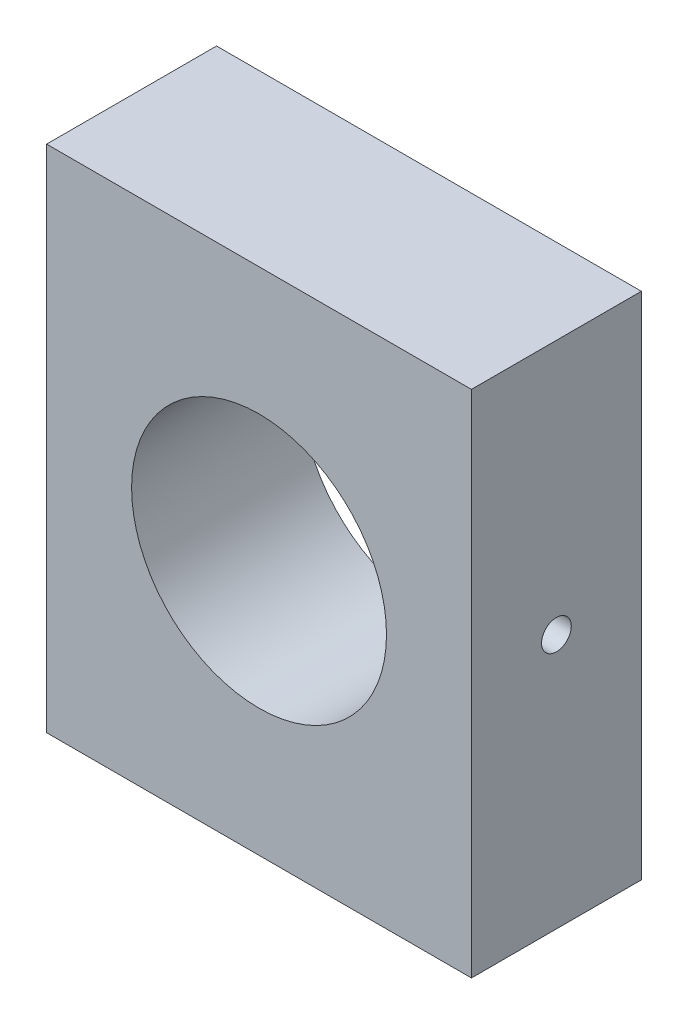
ISO-10303-21;
HEADER;
FILE_DESCRIPTION(('STEP AP214'),'2;1');
FILE_NAME('part.step','',(''),(''),'','','');
FILE_SCHEMA(('AUTOMOTIVE_DESIGN { 1 0 10303 214 1 1 1 1 }'));
ENDSEC;
DATA;
#1=APPLICATION_CONTEXT('core data for automotive mechanical design processes');
#2=APPLICATION_PROTOCOL_DEFINITION('international standard','automotive_design',2000,#1);
#3=PRODUCT_CONTEXT('',#1,'mechanical');
#4=PRODUCT('Part','Part','',(#3));
#5=PRODUCT_RELATED_PRODUCT_CATEGORY('part','',(#4));
#6=PRODUCT_DEFINITION_FORMATION('','',#4);
#7=PRODUCT_DEFINITION_CONTEXT('part definition',#1,'design');
#8=PRODUCT_DEFINITION('design','',#6,#7);
#9=PRODUCT_DEFINITION_SHAPE('','',#8);
#10=(LENGTH_UNIT() NAMED_UNIT(*) SI_UNIT(.MILLI.,.METRE.));
#11=(NAMED_UNIT(*) PLANE_ANGLE_UNIT() SI_UNIT($,.RADIAN.));
#12=(NAMED_UNIT(*) SI_UNIT($,.STERADIAN.) SOLID_ANGLE_UNIT());
#13=UNCERTAINTY_MEASURE_WITH_UNIT(LENGTH_MEASURE(1.E-05),#10,'distance_accuracy_value','');
#14=(GEOMETRIC_REPRESENTATION_CONTEXT(3) GLOBAL_UNCERTAINTY_ASSIGNED_CONTEXT((#13)) GLOBAL_UNIT_ASSIGNED_CONTEXT((#10,
#11,#12)) REPRESENTATION_CONTEXT('',''));
#15=CARTESIAN_POINT('',(0.,0.,0.));
#16=DIRECTION('',(0.,0.,1.));
#17=DIRECTION('',(1.,0.,0.));
#18=AXIS2_PLACEMENT_3D('',#15,#16,#17);
#19=CARTESIAN_POINT('',(0.,0.,40.));
#20=DIRECTION('',(0.,0.,1.));
#21=DIRECTION('',(1.,0.,0.));
#22=AXIS2_PLACEMENT_3D('',#19,#20,#21);
#23=PLANE('',#22);
#24=DIRECTION('',(0.,-1.,0.));
#25=VECTOR('',#24,1.);
#26=CARTESIAN_POINT('',(-34.5135037504516,45.0602409638554,40.));
#27=LINE('',#26,#25);
#28=CARTESIAN_POINT('',(-34.5135037504516,45.0602409638554,40.));
#29=VERTEX_POINT('',#28);
#30=CARTESIAN_POINT('',(-34.5135037504515,-74.9397590361446,40.));
#31=VERTEX_POINT('',#30);
#32=EDGE_CURVE('E90',#29,#31,#27,.T.);
#33=ORIENTED_EDGE('',*,*,#32,.T.);
#34=DIRECTION('',(1.,0.,0.));
#35=VECTOR('',#34,1.);
#36=CARTESIAN_POINT('',(-34.5135037504515,-74.9397590361446,40.));
#37=LINE('',#36,#35);
#38=CARTESIAN_POINT('',(65.4864962495484,-74.9397590361446,40.));
#39=VERTEX_POINT('',#38);
#40=EDGE_CURVE('E85',#31,#39,#37,.T.);
#41=ORIENTED_EDGE('',*,*,#40,.T.);
#42=DIRECTION('',(0.,1.,0.));
#43=VECTOR('',#42,1.);
#44=CARTESIAN_POINT('',(65.4864962495484,45.0602409638554,40.));
#45=LINE('',#44,#43);
#46=CARTESIAN_POINT('',(65.4864962495484,45.0602409638554,40.));
#47=VERTEX_POINT('',#46);
#48=EDGE_CURVE('E88',#39,#47,#45,.T.);
#49=ORIENTED_EDGE('',*,*,#48,.T.);
#50=DIRECTION('',(-1.,0.,0.));
#51=VECTOR('',#50,1.);
#52=CARTESIAN_POINT('',(-34.5135037504516,45.0602409638554,40.));
#53=LINE('',#52,#51);
#54=EDGE_CURVE('E55',#47,#29,#53,.T.);
#55=ORIENTED_EDGE('',*,*,#54,.T.);
#56=EDGE_LOOP('',(#33,#41,#49,#55));
#57=FACE_BOUND('',#56,.T.);
#58=CARTESIAN_POINT('',(15.4864962495484,-14.9397590361446,40.));
#59=DIRECTION('',(0.,0.,1.));
#60=DIRECTION('',(1.,0.,0.));
#61=AXIS2_PLACEMENT_3D('',#58,#59,#60);
#62=CIRCLE('',#61,30.);
#63=CARTESIAN_POINT('',(45.4864962495485,-14.9397590361446,40.));
#64=VERTEX_POINT('',#63);
#65=EDGE_CURVE('E105',#64,#64,#62,.T.);
#66=ORIENTED_EDGE('',*,*,#65,.F.);
#67=EDGE_LOOP('',(#66));
#68=FACE_BOUND('',#67,.T.);
#69=ADVANCED_FACE('F38',(#57,#68),#23,.T.);
#70=CARTESIAN_POINT('',(0.,0.,0.));
#71=DIRECTION('',(0.,0.,1.));
#72=DIRECTION('',(1.,0.,0.));
#73=AXIS2_PLACEMENT_3D('',#70,#71,#72);
#74=PLANE('',#73);
#75=DIRECTION('',(0.,-1.,0.));
#76=VECTOR('',#75,1.);
#77=CARTESIAN_POINT('',(-34.5135037504516,45.0602409638554,0.));
#78=LINE('',#77,#76);
#79=CARTESIAN_POINT('',(-34.5135037504516,45.0602409638554,0.));
#80=VERTEX_POINT('',#79);
#81=CARTESIAN_POINT('',(-34.5135037504515,-74.9397590361446,0.));
#82=VERTEX_POINT('',#81);
#83=EDGE_CURVE('E102',#80,#82,#78,.T.);
#84=ORIENTED_EDGE('',*,*,#83,.F.);
#85=DIRECTION('',(-1.,0.,0.));
#86=VECTOR('',#85,1.);
#87=CARTESIAN_POINT('',(-34.5135037504516,45.0602409638554,0.));
#88=LINE('',#87,#86);
#89=CARTESIAN_POINT('',(65.4864962495484,45.0602409638554,0.));
#90=VERTEX_POINT('',#89);
#91=EDGE_CURVE('E78',#90,#80,#88,.T.);
#92=ORIENTED_EDGE('',*,*,#91,.F.);
#93=DIRECTION('',(0.,1.,0.));
#94=VECTOR('',#93,1.);
#95=CARTESIAN_POINT('',(65.4864962495484,45.0602409638554,0.));
#96=LINE('',#95,#94);
#97=CARTESIAN_POINT('',(65.4864962495484,-74.9397590361446,0.));
#98=VERTEX_POINT('',#97);
#99=EDGE_CURVE('E72',#98,#90,#96,.T.);
#100=ORIENTED_EDGE('',*,*,#99,.F.);
#101=DIRECTION('',(1.,0.,0.));
#102=VECTOR('',#101,1.);
#103=CARTESIAN_POINT('',(-34.5135037504515,-74.9397590361446,0.));
#104=LINE('',#103,#102);
#105=EDGE_CURVE('E94',#82,#98,#104,.T.);
#106=ORIENTED_EDGE('',*,*,#105,.F.);
#107=EDGE_LOOP('',(#84,#92,#100,#106));
#108=FACE_BOUND('',#107,.T.);
#109=CARTESIAN_POINT('',(15.4864962495484,-14.9397590361446,0.));
#110=DIRECTION('',(0.,0.,1.));
#111=DIRECTION('',(1.,0.,0.));
#112=AXIS2_PLACEMENT_3D('',#109,#110,#111);
#113=CIRCLE('',#112,30.);
#114=CARTESIAN_POINT('',(45.4864962495485,-14.9397590361446,0.));
#115=VERTEX_POINT('',#114);
#116=EDGE_CURVE('E117',#115,#115,#113,.T.);
#117=ORIENTED_EDGE('',*,*,#116,.T.);
#118=EDGE_LOOP('',(#117));
#119=FACE_BOUND('',#118,.T.);
#120=ADVANCED_FACE('F113',(#108,#119),#74,.F.);
#121=CARTESIAN_POINT('',(-34.5135037504516,45.0602409638554,40.));
#122=DIRECTION('',(1.,0.,0.));
#123=DIRECTION('',(0.,1.,0.));
#124=AXIS2_PLACEMENT_3D('',#121,#122,#123);
#125=PLANE('',#124);
#126=CARTESIAN_POINT('',(-34.5135037504516,-14.9397590361446,20.));
#127=DIRECTION('',(-1.,0.,0.));
#128=DIRECTION('',(0.,-1.,0.));
#129=AXIS2_PLACEMENT_3D('',#126,#127,#128);
#130=CIRCLE('',#129,3.5);
#131=CARTESIAN_POINT('',(-34.5135037504516,-18.4397590361446,20.));
#132=VERTEX_POINT('',#131);
#133=EDGE_CURVE('E123',#132,#132,#130,.T.);
#134=ORIENTED_EDGE('',*,*,#133,.F.);
#135=EDGE_LOOP('',(#134));
#136=FACE_BOUND('',#135,.T.);
#137=ORIENTED_EDGE('',*,*,#83,.T.);
#138=DIRECTION('',(0.,0.,-1.));
#139=VECTOR('',#138,1.);
#140=CARTESIAN_POINT('',(-34.5135037504515,-74.9397590361446,40.));
#141=LINE('',#140,#139);
#142=EDGE_CURVE('E11',#31,#82,#141,.T.);
#143=ORIENTED_EDGE('',*,*,#142,.F.);
#144=ORIENTED_EDGE('',*,*,#32,.F.);
#145=DIRECTION('',(0.,0.,-1.));
#146=VECTOR('',#145,1.);
#147=CARTESIAN_POINT('',(-34.5135037504516,45.0602409638554,40.));
#148=LINE('',#147,#146);
#149=EDGE_CURVE('E98',#29,#80,#148,.T.);
#150=ORIENTED_EDGE('',*,*,#149,.T.);
#151=EDGE_LOOP('',(#137,#143,#144,#150));
#152=FACE_BOUND('',#151,.T.);
#153=ADVANCED_FACE('F40',(#136,#152),#125,.F.);
#154=CARTESIAN_POINT('',(-34.5135037504515,-74.9397590361446,40.));
#155=DIRECTION('',(0.,1.,0.));
#156=DIRECTION('',(-1.,0.,0.));
#157=AXIS2_PLACEMENT_3D('',#154,#155,#156);
#158=PLANE('',#157);
#159=ORIENTED_EDGE('',*,*,#105,.T.);
#160=DIRECTION('',(0.,0.,-1.));
#161=VECTOR('',#160,1.);
#162=CARTESIAN_POINT('',(65.4864962495484,-74.9397590361446,40.));
#163=LINE('',#162,#161);
#164=EDGE_CURVE('E47',#39,#98,#163,.T.);
#165=ORIENTED_EDGE('',*,*,#164,.F.);
#166=ORIENTED_EDGE('',*,*,#40,.F.);
#167=ORIENTED_EDGE('',*,*,#142,.T.);
#168=EDGE_LOOP('',(#159,#165,#166,#167));
#169=FACE_BOUND('',#168,.T.);
#170=ADVANCED_FACE('F93',(#169),#158,.F.);
#171=CARTESIAN_POINT('',(65.4864962495484,45.0602409638554,40.));
#172=DIRECTION('',(-1.,0.,0.));
#173=DIRECTION('',(0.,0.,1.));
#174=AXIS2_PLACEMENT_3D('',#171,#172,#173);
#175=PLANE('',#174);
#176=CARTESIAN_POINT('',(65.4864962495484,-14.9397590361446,20.));
#177=DIRECTION('',(1.,0.,0.));
#178=DIRECTION('',(0.,0.,-1.));
#179=AXIS2_PLACEMENT_3D('',#176,#177,#178);
#180=CIRCLE('',#179,3.5);
#181=CARTESIAN_POINT('',(65.4864962495484,-14.9397590361446,16.5));
#182=VERTEX_POINT('',#181);
#183=EDGE_CURVE('E129',#182,#182,#180,.T.);
#184=ORIENTED_EDGE('',*,*,#183,.F.);
#185=EDGE_LOOP('',(#184));
#186=FACE_BOUND('',#185,.T.);
#187=ORIENTED_EDGE('',*,*,#99,.T.);
#188=DIRECTION('',(0.,0.,-1.));
#189=VECTOR('',#188,1.);
#190=CARTESIAN_POINT('',(65.4864962495484,45.0602409638554,40.));
#191=LINE('',#190,#189);
#192=EDGE_CURVE('E95',#47,#90,#191,.T.);
#193=ORIENTED_EDGE('',*,*,#192,.F.);
#194=ORIENTED_EDGE('',*,*,#48,.F.);
#195=ORIENTED_EDGE('',*,*,#164,.T.);
#196=EDGE_LOOP('',(#187,#193,#194,#195));
#197=FACE_BOUND('',#196,.T.);
#198=ADVANCED_FACE('F96',(#186,#197),#175,.F.);
#199=CARTESIAN_POINT('',(-34.5135037504516,45.0602409638554,40.));
#200=DIRECTION('',(0.,-1.,0.));
#201=DIRECTION('',(0.,0.,-1.));
#202=AXIS2_PLACEMENT_3D('',#199,#200,#201);
#203=PLANE('',#202);
#204=ORIENTED_EDGE('',*,*,#91,.T.);
#205=ORIENTED_EDGE('',*,*,#149,.F.);
#206=ORIENTED_EDGE('',*,*,#54,.F.);
#207=ORIENTED_EDGE('',*,*,#192,.T.);
#208=EDGE_LOOP('',(#204,#205,#206,#207));
#209=FACE_BOUND('',#208,.T.);
#210=ADVANCED_FACE('F110',(#209),#203,.F.);
#211=CARTESIAN_POINT('',(15.4864962495484,-14.9397590361446,40.));
#212=DIRECTION('',(0.,0.,-1.));
#213=DIRECTION('',(-1.,0.,0.));
#214=AXIS2_PLACEMENT_3D('',#211,#212,#213);
#215=CYLINDRICAL_SURFACE('',#214,30.);
#216=ORIENTED_EDGE('',*,*,#65,.T.);
#217=EDGE_LOOP('',(#216));
#218=FACE_BOUND('',#217,.T.);
#219=ORIENTED_EDGE('',*,*,#116,.F.);
#220=EDGE_LOOP('',(#219));
#221=FACE_BOUND('',#220,.T.);
#222=ADVANCED_FACE('F150',(#218,#221),#215,.F.);
#223=CARTESIAN_POINT('',(-19.5135037504516,-14.9397590361446,20.));
#224=DIRECTION('',(-1.,0.,0.));
#225=DIRECTION('',(0.,-1.,0.));
#226=AXIS2_PLACEMENT_3D('',#223,#224,#225);
#227=CYLINDRICAL_SURFACE('',#226,3.5);
#228=CARTESIAN_POINT('',(-19.5135037504516,-14.9397590361446,20.));
#229=DIRECTION('',(-1.,0.,0.));
#230=DIRECTION('',(0.,-1.,0.));
#231=AXIS2_PLACEMENT_3D('',#228,#229,#230);
#232=CIRCLE('',#231,3.5);
#233=CARTESIAN_POINT('',(-19.5135037504516,-18.4397590361446,20.));
#234=VERTEX_POINT('',#233);
#235=EDGE_CURVE('E120',#234,#234,#232,.T.);
#236=ORIENTED_EDGE('',*,*,#235,.F.);
#237=EDGE_LOOP('',(#236));
#238=FACE_BOUND('',#237,.T.);
#239=ORIENTED_EDGE('',*,*,#133,.T.);
#240=EDGE_LOOP('',(#239));
#241=FACE_BOUND('',#240,.T.);
#242=ADVANCED_FACE('F161',(#238,#241),#227,.F.);
#243=CARTESIAN_POINT('',(-19.5135037504516,-14.9397590361446,20.));
#244=DIRECTION('',(-1.,0.,0.));
#245=DIRECTION('',(0.,-1.,0.));
#246=AXIS2_PLACEMENT_3D('',#243,#244,#245);
#247=PLANE('',#246);
#248=ORIENTED_EDGE('',*,*,#235,.T.);
#249=EDGE_LOOP('',(#248));
#250=FACE_BOUND('',#249,.T.);
#251=ADVANCED_FACE('F140',(#250),#247,.T.);
#252=CARTESIAN_POINT('',(50.4864962495484,-14.9397590361446,20.));
#253=DIRECTION('',(1.,0.,0.));
#254=DIRECTION('',(0.,0.,-1.));
#255=AXIS2_PLACEMENT_3D('',#252,#253,#254);
#256=CYLINDRICAL_SURFACE('',#255,3.5);
#257=CARTESIAN_POINT('',(50.4864962495484,-14.9397590361446,20.));
#258=DIRECTION('',(1.,0.,0.));
#259=DIRECTION('',(0.,0.,-1.));
#260=AXIS2_PLACEMENT_3D('',#257,#258,#259);
#261=CIRCLE('',#260,3.5);
#262=CARTESIAN_POINT('',(50.4864962495484,-14.9397590361446,16.5));
#263=VERTEX_POINT('',#262);
#264=EDGE_CURVE('E126',#263,#263,#261,.T.);
#265=ORIENTED_EDGE('',*,*,#264,.F.);
#266=EDGE_LOOP('',(#265));
#267=FACE_BOUND('',#266,.T.);
#268=ORIENTED_EDGE('',*,*,#183,.T.);
#269=EDGE_LOOP('',(#268));
#270=FACE_BOUND('',#269,.T.);
#271=ADVANCED_FACE('F137',(#267,#270),#256,.F.);
#272=CARTESIAN_POINT('',(50.4864962495484,-14.9397590361446,20.));
#273=DIRECTION('',(1.,0.,0.));
#274=DIRECTION('',(0.,0.,-1.));
#275=AXIS2_PLACEMENT_3D('',#272,#273,#274);
#276=PLANE('',#275);
#277=ORIENTED_EDGE('',*,*,#264,.T.);
#278=EDGE_LOOP('',(#277));
#279=FACE_BOUND('',#278,.T.);
#280=ADVANCED_FACE('F135',(#279),#276,.T.);
#281=CLOSED_SHELL('',(#69,#120,#153,#170,#198,#210,#222,#242,#251,#271,#280));
#282=MANIFOLD_SOLID_BREP('B2',#281);
#283=ADVANCED_BREP_SHAPE_REPRESENTATION('',(#18,#282),#14);
#284=SHAPE_DEFINITION_REPRESENTATION(#9,#283);
ENDSEC;
END-ISO-10303-21;
